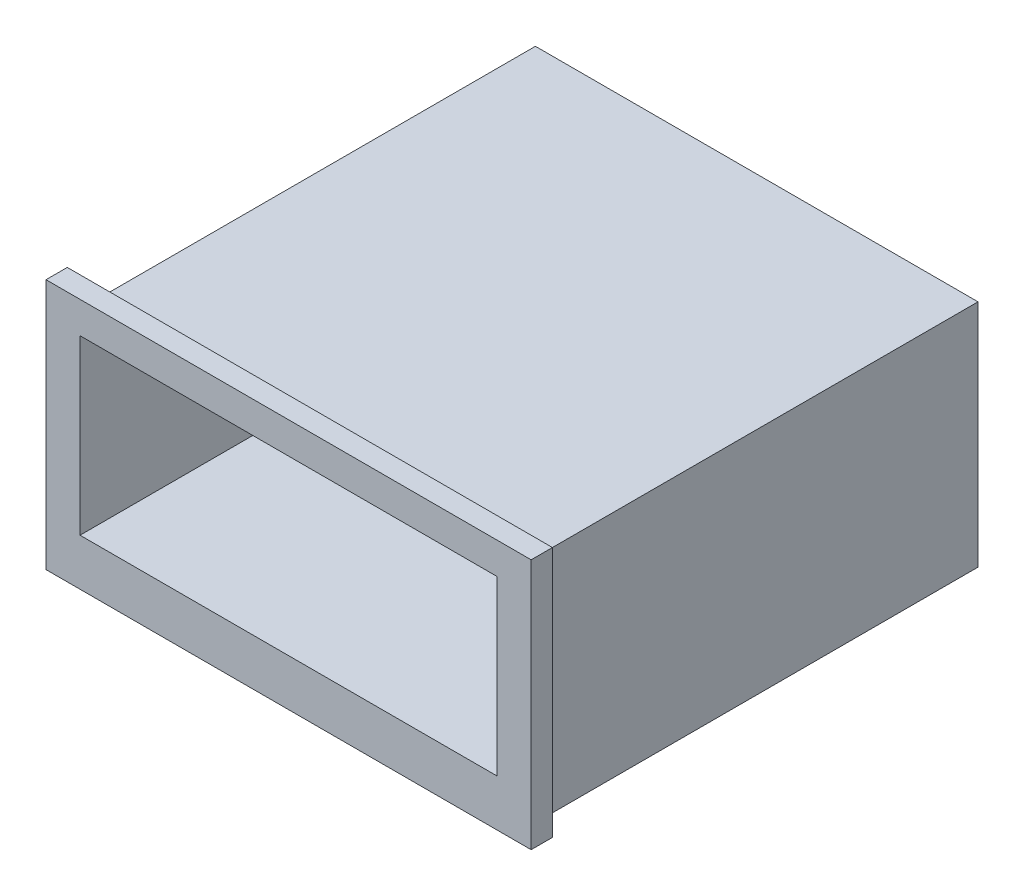
ISO-10303-21;
HEADER;
FILE_DESCRIPTION(('STEP AP214'),'2;1');
FILE_NAME('part.step','',(''),(''),'','','');
FILE_SCHEMA(('AUTOMOTIVE_DESIGN { 1 0 10303 214 1 1 1 1 }'));
ENDSEC;
DATA;
#1=APPLICATION_CONTEXT('core data for automotive mechanical design processes');
#2=APPLICATION_PROTOCOL_DEFINITION('international standard','automotive_design',2000,#1);
#3=PRODUCT_CONTEXT('',#1,'mechanical');
#4=PRODUCT('Part','Part','',(#3));
#5=PRODUCT_RELATED_PRODUCT_CATEGORY('part','',(#4));
#6=PRODUCT_DEFINITION_FORMATION('','',#4);
#7=PRODUCT_DEFINITION_CONTEXT('part definition',#1,'design');
#8=PRODUCT_DEFINITION('design','',#6,#7);
#9=PRODUCT_DEFINITION_SHAPE('','',#8);
#10=(LENGTH_UNIT() NAMED_UNIT(*) SI_UNIT(.MILLI.,.METRE.));
#11=(NAMED_UNIT(*) PLANE_ANGLE_UNIT() SI_UNIT($,.RADIAN.));
#12=(NAMED_UNIT(*) SI_UNIT($,.STERADIAN.) SOLID_ANGLE_UNIT());
#13=UNCERTAINTY_MEASURE_WITH_UNIT(LENGTH_MEASURE(1.E-05),#10,'distance_accuracy_value','');
#14=(GEOMETRIC_REPRESENTATION_CONTEXT(3) GLOBAL_UNCERTAINTY_ASSIGNED_CONTEXT((#13)) GLOBAL_UNIT_ASSIGNED_CONTEXT((#10,
#11,#12)) REPRESENTATION_CONTEXT('',''));
#15=CARTESIAN_POINT('',(0.,0.,0.));
#16=DIRECTION('',(0.,0.,1.));
#17=DIRECTION('',(1.,0.,0.));
#18=AXIS2_PLACEMENT_3D('',#15,#16,#17);
#19=CARTESIAN_POINT('',(-6.223,6.5532,0.635));
#20=DIRECTION('',(0.,0.,1.));
#21=DIRECTION('',(1.,0.,0.));
#22=AXIS2_PLACEMENT_3D('',#19,#20,#21);
#23=PLANE('',#22);
#24=DIRECTION('',(0.,1.,0.));
#25=VECTOR('',#24,1.);
#26=CARTESIAN_POINT('',(6.223,6.5532,0.635));
#27=LINE('',#26,#25);
#28=CARTESIAN_POINT('',(6.223,1.397,0.635));
#29=VERTEX_POINT('',#28);
#30=CARTESIAN_POINT('',(6.223,6.5532,0.635));
#31=VERTEX_POINT('',#30);
#32=EDGE_CURVE('E104',#29,#31,#27,.T.);
#33=ORIENTED_EDGE('',*,*,#32,.T.);
#34=DIRECTION('',(1.,0.,0.));
#35=VECTOR('',#34,1.);
#36=CARTESIAN_POINT('',(-6.223,6.5532,0.635));
#37=LINE('',#36,#35);
#38=CARTESIAN_POINT('',(-6.223,6.5532,0.635));
#39=VERTEX_POINT('',#38);
#40=EDGE_CURVE('E212',#31,#39,#37,.F.);
#41=ORIENTED_EDGE('',*,*,#40,.T.);
#42=DIRECTION('',(0.,1.,0.));
#43=VECTOR('',#42,1.);
#44=CARTESIAN_POINT('',(-6.223,6.5532,0.635));
#45=LINE('',#44,#43);
#46=CARTESIAN_POINT('',(-6.223,1.397,0.635));
#47=VERTEX_POINT('',#46);
#48=EDGE_CURVE('E109',#39,#47,#45,.F.);
#49=ORIENTED_EDGE('',*,*,#48,.T.);
#50=DIRECTION('',(1.,0.,0.));
#51=VECTOR('',#50,1.);
#52=CARTESIAN_POINT('',(-6.223,1.397,0.635));
#53=LINE('',#52,#51);
#54=EDGE_CURVE('E107',#47,#29,#53,.T.);
#55=ORIENTED_EDGE('',*,*,#54,.T.);
#56=EDGE_LOOP('',(#33,#41,#49,#55));
#57=FACE_BOUND('',#56,.T.);
#58=ADVANCED_FACE('F17',(#57),#23,.T.);
#59=CARTESIAN_POINT('',(-7.239,7.493,6.35));
#60=DIRECTION('',(-1.,0.,0.));
#61=DIRECTION('',(0.,0.,1.));
#62=AXIS2_PLACEMENT_3D('',#59,#60,#61);
#63=PLANE('',#62);
#64=DIRECTION('',(0.,1.,0.));
#65=VECTOR('',#64,1.);
#66=CARTESIAN_POINT('',(-7.239,0.,6.35));
#67=LINE('',#66,#65);
#68=CARTESIAN_POINT('',(-7.239,7.493,6.35));
#69=VERTEX_POINT('',#68);
#70=CARTESIAN_POINT('',(-7.239,0.,6.35));
#71=VERTEX_POINT('',#70);
#72=EDGE_CURVE('E144',#69,#71,#67,.F.);
#73=ORIENTED_EDGE('',*,*,#72,.T.);
#74=DIRECTION('',(0.,0.,1.));
#75=VECTOR('',#74,1.);
#76=CARTESIAN_POINT('',(-7.239,0.,6.35));
#77=LINE('',#76,#75);
#78=CARTESIAN_POINT('',(-7.239,0.,6.985));
#79=VERTEX_POINT('',#78);
#80=EDGE_CURVE('E20',#71,#79,#77,.T.);
#81=ORIENTED_EDGE('',*,*,#80,.T.);
#82=DIRECTION('',(0.,1.,0.));
#83=VECTOR('',#82,1.);
#84=CARTESIAN_POINT('',(-7.239,6.858,6.985));
#85=LINE('',#84,#83);
#86=CARTESIAN_POINT('',(-7.239,7.493,6.985));
#87=VERTEX_POINT('',#86);
#88=EDGE_CURVE('E142',#79,#87,#85,.T.);
#89=ORIENTED_EDGE('',*,*,#88,.T.);
#90=DIRECTION('',(0.,0.,1.));
#91=VECTOR('',#90,1.);
#92=CARTESIAN_POINT('',(-7.239,7.493,6.35));
#93=LINE('',#92,#91);
#94=EDGE_CURVE('E132',#69,#87,#93,.T.);
#95=ORIENTED_EDGE('',*,*,#94,.F.);
#96=EDGE_LOOP('',(#73,#81,#89,#95));
#97=FACE_BOUND('',#96,.T.);
#98=ADVANCED_FACE('F141',(#97),#63,.T.);
#99=CARTESIAN_POINT('',(-7.239,7.493,6.35));
#100=DIRECTION('',(0.,1.,0.));
#101=DIRECTION('',(0.,0.,1.));
#102=AXIS2_PLACEMENT_3D('',#99,#100,#101);
#103=PLANE('',#102);
#104=DIRECTION('',(1.,0.,0.));
#105=VECTOR('',#104,1.);
#106=CARTESIAN_POINT('',(-7.239,7.493,6.35));
#107=LINE('',#106,#105);
#108=CARTESIAN_POINT('',(7.239,7.493,6.35));
#109=VERTEX_POINT('',#108);
#110=EDGE_CURVE('E204',#109,#69,#107,.F.);
#111=ORIENTED_EDGE('',*,*,#110,.T.);
#112=ORIENTED_EDGE('',*,*,#94,.T.);
#113=DIRECTION('',(-1.,0.,0.));
#114=VECTOR('',#113,1.);
#115=CARTESIAN_POINT('',(-6.604,7.493,6.985));
#116=LINE('',#115,#114);
#117=CARTESIAN_POINT('',(7.239,7.493,6.985));
#118=VERTEX_POINT('',#117);
#119=EDGE_CURVE('E152',#87,#118,#116,.F.);
#120=ORIENTED_EDGE('',*,*,#119,.T.);
#121=DIRECTION('',(0.,0.,-1.));
#122=VECTOR('',#121,1.);
#123=CARTESIAN_POINT('',(7.239,7.493,6.35));
#124=LINE('',#123,#122);
#125=EDGE_CURVE('E115',#109,#118,#124,.F.);
#126=ORIENTED_EDGE('',*,*,#125,.F.);
#127=EDGE_LOOP('',(#111,#112,#120,#126));
#128=FACE_BOUND('',#127,.T.);
#129=ADVANCED_FACE('F307',(#128),#103,.T.);
#130=CARTESIAN_POINT('',(7.239,7.493,6.35));
#131=DIRECTION('',(1.,0.,0.));
#132=DIRECTION('',(0.,0.,-1.));
#133=AXIS2_PLACEMENT_3D('',#130,#131,#132);
#134=PLANE('',#133);
#135=DIRECTION('',(0.,1.,0.));
#136=VECTOR('',#135,1.);
#137=CARTESIAN_POINT('',(7.239,0.,6.35));
#138=LINE('',#137,#136);
#139=CARTESIAN_POINT('',(7.239,0.,6.35));
#140=VERTEX_POINT('',#139);
#141=EDGE_CURVE('E197',#140,#109,#138,.T.);
#142=ORIENTED_EDGE('',*,*,#141,.T.);
#143=ORIENTED_EDGE('',*,*,#125,.T.);
#144=DIRECTION('',(0.,1.,0.));
#145=VECTOR('',#144,1.);
#146=CARTESIAN_POINT('',(7.239,6.858,6.985));
#147=LINE('',#146,#145);
#148=CARTESIAN_POINT('',(7.239,0.,6.985));
#149=VERTEX_POINT('',#148);
#150=EDGE_CURVE('E182',#118,#149,#147,.F.);
#151=ORIENTED_EDGE('',*,*,#150,.T.);
#152=DIRECTION('',(0.,0.,-1.));
#153=VECTOR('',#152,1.);
#154=CARTESIAN_POINT('',(7.239,0.,6.35));
#155=LINE('',#154,#153);
#156=EDGE_CURVE('E131',#149,#140,#155,.T.);
#157=ORIENTED_EDGE('',*,*,#156,.T.);
#158=EDGE_LOOP('',(#142,#143,#151,#157));
#159=FACE_BOUND('',#158,.T.);
#160=ADVANCED_FACE('F300',(#159),#134,.T.);
#161=CARTESIAN_POINT('',(-6.223,1.397,0.635));
#162=DIRECTION('',(0.,-1.,0.));
#163=DIRECTION('',(0.,0.,-1.));
#164=AXIS2_PLACEMENT_3D('',#161,#162,#163);
#165=PLANE('',#164);
#166=ORIENTED_EDGE('',*,*,#54,.F.);
#167=DIRECTION('',(0.,0.,1.));
#168=VECTOR('',#167,1.);
#169=CARTESIAN_POINT('',(-6.223,1.397,0.635));
#170=LINE('',#169,#168);
#171=CARTESIAN_POINT('',(-6.223,1.397,6.985));
#172=VERTEX_POINT('',#171);
#173=EDGE_CURVE('E206',#47,#172,#170,.T.);
#174=ORIENTED_EDGE('',*,*,#173,.T.);
#175=DIRECTION('',(-1.,0.,0.));
#176=VECTOR('',#175,1.);
#177=CARTESIAN_POINT('',(-6.604,1.397,6.985));
#178=LINE('',#177,#176);
#179=CARTESIAN_POINT('',(6.223,1.397,6.985));
#180=VERTEX_POINT('',#179);
#181=EDGE_CURVE('E126',#172,#180,#178,.F.);
#182=ORIENTED_EDGE('',*,*,#181,.T.);
#183=DIRECTION('',(0.,0.,-1.));
#184=VECTOR('',#183,1.);
#185=CARTESIAN_POINT('',(6.223,1.397,0.635));
#186=LINE('',#185,#184);
#187=EDGE_CURVE('E114',#180,#29,#186,.T.);
#188=ORIENTED_EDGE('',*,*,#187,.T.);
#189=EDGE_LOOP('',(#166,#174,#182,#188));
#190=FACE_BOUND('',#189,.T.);
#191=ADVANCED_FACE('F125',(#190),#165,.F.);
#192=CARTESIAN_POINT('',(6.223,6.5532,0.635));
#193=DIRECTION('',(1.,0.,0.));
#194=DIRECTION('',(0.,0.,-1.));
#195=AXIS2_PLACEMENT_3D('',#192,#193,#194);
#196=PLANE('',#195);
#197=ORIENTED_EDGE('',*,*,#32,.F.);
#198=ORIENTED_EDGE('',*,*,#187,.F.);
#199=DIRECTION('',(0.,1.,0.));
#200=VECTOR('',#199,1.);
#201=CARTESIAN_POINT('',(6.223,6.858,6.985));
#202=LINE('',#201,#200);
#203=CARTESIAN_POINT('',(6.223,6.5532,6.985));
#204=VERTEX_POINT('',#203);
#205=EDGE_CURVE('E179',#180,#204,#202,.T.);
#206=ORIENTED_EDGE('',*,*,#205,.T.);
#207=DIRECTION('',(0.,0.,1.));
#208=VECTOR('',#207,1.);
#209=CARTESIAN_POINT('',(6.223,6.5532,0.635));
#210=LINE('',#209,#208);
#211=EDGE_CURVE('E122',#204,#31,#210,.F.);
#212=ORIENTED_EDGE('',*,*,#211,.T.);
#213=EDGE_LOOP('',(#197,#198,#206,#212));
#214=FACE_BOUND('',#213,.T.);
#215=ADVANCED_FACE('F119',(#214),#196,.F.);
#216=CARTESIAN_POINT('',(-6.223,6.5532,0.635));
#217=DIRECTION('',(0.,1.,0.));
#218=DIRECTION('',(0.,0.,1.));
#219=AXIS2_PLACEMENT_3D('',#216,#217,#218);
#220=PLANE('',#219);
#221=ORIENTED_EDGE('',*,*,#40,.F.);
#222=ORIENTED_EDGE('',*,*,#211,.F.);
#223=DIRECTION('',(-1.,0.,0.));
#224=VECTOR('',#223,1.);
#225=CARTESIAN_POINT('',(-6.604,6.5532,6.985));
#226=LINE('',#225,#224);
#227=CARTESIAN_POINT('',(-6.223,6.5532,6.985));
#228=VERTEX_POINT('',#227);
#229=EDGE_CURVE('E176',#204,#228,#226,.T.);
#230=ORIENTED_EDGE('',*,*,#229,.T.);
#231=DIRECTION('',(0.,0.,1.));
#232=VECTOR('',#231,1.);
#233=CARTESIAN_POINT('',(-6.223,6.5532,0.635));
#234=LINE('',#233,#232);
#235=EDGE_CURVE('E209',#228,#39,#234,.F.);
#236=ORIENTED_EDGE('',*,*,#235,.T.);
#237=EDGE_LOOP('',(#221,#222,#230,#236));
#238=FACE_BOUND('',#237,.T.);
#239=ADVANCED_FACE('F217',(#238),#220,.F.);
#240=CARTESIAN_POINT('',(-6.223,6.5532,0.635));
#241=DIRECTION('',(-1.,0.,0.));
#242=DIRECTION('',(0.,0.,1.));
#243=AXIS2_PLACEMENT_3D('',#240,#241,#242);
#244=PLANE('',#243);
#245=ORIENTED_EDGE('',*,*,#48,.F.);
#246=ORIENTED_EDGE('',*,*,#235,.F.);
#247=DIRECTION('',(0.,1.,0.));
#248=VECTOR('',#247,1.);
#249=CARTESIAN_POINT('',(-6.223,6.858,6.985));
#250=LINE('',#249,#248);
#251=EDGE_CURVE('E173',#228,#172,#250,.F.);
#252=ORIENTED_EDGE('',*,*,#251,.T.);
#253=ORIENTED_EDGE('',*,*,#173,.F.);
#254=EDGE_LOOP('',(#245,#246,#252,#253));
#255=FACE_BOUND('',#254,.T.);
#256=ADVANCED_FACE('F215',(#255),#244,.F.);
#257=CARTESIAN_POINT('',(-7.239,0.,6.35));
#258=DIRECTION('',(0.,0.,1.));
#259=DIRECTION('',(1.,0.,0.));
#260=AXIS2_PLACEMENT_3D('',#257,#258,#259);
#261=PLANE('',#260);
#262=DIRECTION('',(1.,0.,0.));
#263=VECTOR('',#262,1.);
#264=CARTESIAN_POINT('',(-7.239,0.,6.35));
#265=LINE('',#264,#263);
#266=CARTESIAN_POINT('',(6.604,0.,6.35));
#267=VERTEX_POINT('',#266);
#268=EDGE_CURVE('E35',#267,#140,#265,.T.);
#269=ORIENTED_EDGE('',*,*,#268,.F.);
#270=DIRECTION('',(0.,1.,0.));
#271=VECTOR('',#270,1.);
#272=CARTESIAN_POINT('',(6.604,6.858,6.35));
#273=LINE('',#272,#271);
#274=CARTESIAN_POINT('',(6.604,6.858,6.35));
#275=VERTEX_POINT('',#274);
#276=EDGE_CURVE('E171',#267,#275,#273,.T.);
#277=ORIENTED_EDGE('',*,*,#276,.T.);
#278=DIRECTION('',(1.,0.,0.));
#279=VECTOR('',#278,1.);
#280=CARTESIAN_POINT('',(-6.604,6.858,6.35));
#281=LINE('',#280,#279);
#282=CARTESIAN_POINT('',(-6.604,6.858,6.35));
#283=VERTEX_POINT('',#282);
#284=EDGE_CURVE('E195',#283,#275,#281,.T.);
#285=ORIENTED_EDGE('',*,*,#284,.F.);
#286=DIRECTION('',(0.,1.,0.));
#287=VECTOR('',#286,1.);
#288=CARTESIAN_POINT('',(-6.604,6.858,6.35));
#289=LINE('',#288,#287);
#290=CARTESIAN_POINT('',(-6.604,0.,6.35));
#291=VERTEX_POINT('',#290);
#292=EDGE_CURVE('E190',#283,#291,#289,.F.);
#293=ORIENTED_EDGE('',*,*,#292,.T.);
#294=DIRECTION('',(1.,0.,0.));
#295=VECTOR('',#294,1.);
#296=CARTESIAN_POINT('',(-7.239,0.,6.35));
#297=LINE('',#296,#295);
#298=EDGE_CURVE('E201',#71,#291,#297,.T.);
#299=ORIENTED_EDGE('',*,*,#298,.F.);
#300=ORIENTED_EDGE('',*,*,#72,.F.);
#301=ORIENTED_EDGE('',*,*,#110,.F.);
#302=ORIENTED_EDGE('',*,*,#141,.F.);
#303=EDGE_LOOP('',(#269,#277,#285,#293,#299,#300,#301,#302));
#304=FACE_BOUND('',#303,.T.);
#305=ADVANCED_FACE('F268',(#304),#261,.F.);
#306=CARTESIAN_POINT('',(-6.604,6.858,6.985));
#307=DIRECTION('',(0.,1.,0.));
#308=DIRECTION('',(0.,0.,1.));
#309=AXIS2_PLACEMENT_3D('',#306,#307,#308);
#310=PLANE('',#309);
#311=DIRECTION('',(0.,0.,1.));
#312=VECTOR('',#311,1.);
#313=CARTESIAN_POINT('',(6.604,6.858,-6.985));
#314=LINE('',#313,#312);
#315=CARTESIAN_POINT('',(6.604,6.858,-6.985));
#316=VERTEX_POINT('',#315);
#317=EDGE_CURVE('E168',#275,#316,#314,.F.);
#318=ORIENTED_EDGE('',*,*,#317,.T.);
#319=DIRECTION('',(1.,0.,0.));
#320=VECTOR('',#319,1.);
#321=CARTESIAN_POINT('',(-6.604,6.858,-6.985));
#322=LINE('',#321,#320);
#323=CARTESIAN_POINT('',(-6.604,6.858,-6.985));
#324=VERTEX_POINT('',#323);
#325=EDGE_CURVE('E193',#316,#324,#322,.F.);
#326=ORIENTED_EDGE('',*,*,#325,.T.);
#327=DIRECTION('',(0.,0.,-1.));
#328=VECTOR('',#327,1.);
#329=CARTESIAN_POINT('',(-6.604,6.858,-6.985));
#330=LINE('',#329,#328);
#331=EDGE_CURVE('E153',#324,#283,#330,.F.);
#332=ORIENTED_EDGE('',*,*,#331,.T.);
#333=ORIENTED_EDGE('',*,*,#284,.T.);
#334=EDGE_LOOP('',(#318,#326,#332,#333));
#335=FACE_BOUND('',#334,.T.);
#336=ADVANCED_FACE('F260',(#335),#310,.T.);
#337=CARTESIAN_POINT('',(-6.604,6.858,-6.985));
#338=DIRECTION('',(0.,0.,1.));
#339=DIRECTION('',(1.,0.,0.));
#340=AXIS2_PLACEMENT_3D('',#337,#338,#339);
#341=PLANE('',#340);
#342=ORIENTED_EDGE('',*,*,#325,.F.);
#343=DIRECTION('',(0.,1.,0.));
#344=VECTOR('',#343,1.);
#345=CARTESIAN_POINT('',(6.604,6.858,-6.985));
#346=LINE('',#345,#344);
#347=CARTESIAN_POINT('',(6.604,0.,-6.985));
#348=VERTEX_POINT('',#347);
#349=EDGE_CURVE('E165',#316,#348,#346,.F.);
#350=ORIENTED_EDGE('',*,*,#349,.T.);
#351=DIRECTION('',(1.,0.,0.));
#352=VECTOR('',#351,1.);
#353=CARTESIAN_POINT('',(-6.604,0.,-6.985));
#354=LINE('',#353,#352);
#355=CARTESIAN_POINT('',(-6.604,0.,-6.985));
#356=VERTEX_POINT('',#355);
#357=EDGE_CURVE('E160',#348,#356,#354,.F.);
#358=ORIENTED_EDGE('',*,*,#357,.T.);
#359=DIRECTION('',(0.,1.,0.));
#360=VECTOR('',#359,1.);
#361=CARTESIAN_POINT('',(-6.604,6.858,-6.985));
#362=LINE('',#361,#360);
#363=EDGE_CURVE('E187',#356,#324,#362,.T.);
#364=ORIENTED_EDGE('',*,*,#363,.T.);
#365=EDGE_LOOP('',(#342,#350,#358,#364));
#366=FACE_BOUND('',#365,.T.);
#367=ADVANCED_FACE('F231',(#366),#341,.F.);
#368=CARTESIAN_POINT('',(-6.604,6.858,-6.985));
#369=DIRECTION('',(1.,0.,0.));
#370=DIRECTION('',(0.,0.,-1.));
#371=AXIS2_PLACEMENT_3D('',#368,#369,#370);
#372=PLANE('',#371);
#373=ORIENTED_EDGE('',*,*,#363,.F.);
#374=DIRECTION('',(0.,0.,1.));
#375=VECTOR('',#374,1.);
#376=CARTESIAN_POINT('',(-6.604,0.,6.985));
#377=LINE('',#376,#375);
#378=EDGE_CURVE('E157',#356,#291,#377,.T.);
#379=ORIENTED_EDGE('',*,*,#378,.T.);
#380=ORIENTED_EDGE('',*,*,#292,.F.);
#381=ORIENTED_EDGE('',*,*,#331,.F.);
#382=EDGE_LOOP('',(#373,#379,#380,#381));
#383=FACE_BOUND('',#382,.T.);
#384=ADVANCED_FACE('F222',(#383),#372,.F.);
#385=CARTESIAN_POINT('',(-6.604,6.858,6.985));
#386=DIRECTION('',(0.,0.,-1.));
#387=DIRECTION('',(-1.,0.,0.));
#388=AXIS2_PLACEMENT_3D('',#385,#386,#387);
#389=PLANE('',#388);
#390=ORIENTED_EDGE('',*,*,#229,.F.);
#391=ORIENTED_EDGE('',*,*,#205,.F.);
#392=ORIENTED_EDGE('',*,*,#181,.F.);
#393=ORIENTED_EDGE('',*,*,#251,.F.);
#394=EDGE_LOOP('',(#390,#391,#392,#393));
#395=FACE_BOUND('',#394,.T.);
#396=ORIENTED_EDGE('',*,*,#150,.F.);
#397=ORIENTED_EDGE('',*,*,#119,.F.);
#398=ORIENTED_EDGE('',*,*,#88,.F.);
#399=DIRECTION('',(1.,0.,0.));
#400=VECTOR('',#399,1.);
#401=CARTESIAN_POINT('',(-6.604,0.,6.985));
#402=LINE('',#401,#400);
#403=EDGE_CURVE('E26',#79,#149,#402,.T.);
#404=ORIENTED_EDGE('',*,*,#403,.T.);
#405=EDGE_LOOP('',(#396,#397,#398,#404));
#406=FACE_BOUND('',#405,.T.);
#407=ADVANCED_FACE('F151',(#395,#406),#389,.F.);
#408=CARTESIAN_POINT('',(6.604,6.858,-6.985));
#409=DIRECTION('',(-1.,0.,0.));
#410=DIRECTION('',(0.,0.,1.));
#411=AXIS2_PLACEMENT_3D('',#408,#409,#410);
#412=PLANE('',#411);
#413=ORIENTED_EDGE('',*,*,#349,.F.);
#414=ORIENTED_EDGE('',*,*,#317,.F.);
#415=ORIENTED_EDGE('',*,*,#276,.F.);
#416=DIRECTION('',(0.,0.,1.));
#417=VECTOR('',#416,1.);
#418=CARTESIAN_POINT('',(6.604,0.,6.985));
#419=LINE('',#418,#417);
#420=EDGE_CURVE('E11',#267,#348,#419,.F.);
#421=ORIENTED_EDGE('',*,*,#420,.T.);
#422=EDGE_LOOP('',(#413,#414,#415,#421));
#423=FACE_BOUND('',#422,.T.);
#424=ADVANCED_FACE('F221',(#423),#412,.F.);
#425=CARTESIAN_POINT('',(-6.604,0.,6.985));
#426=DIRECTION('',(0.,1.,0.));
#427=DIRECTION('',(0.,0.,1.));
#428=AXIS2_PLACEMENT_3D('',#425,#426,#427);
#429=PLANE('',#428);
#430=ORIENTED_EDGE('',*,*,#268,.T.);
#431=ORIENTED_EDGE('',*,*,#156,.F.);
#432=ORIENTED_EDGE('',*,*,#403,.F.);
#433=ORIENTED_EDGE('',*,*,#80,.F.);
#434=ORIENTED_EDGE('',*,*,#298,.T.);
#435=ORIENTED_EDGE('',*,*,#378,.F.);
#436=ORIENTED_EDGE('',*,*,#357,.F.);
#437=ORIENTED_EDGE('',*,*,#420,.F.);
#438=EDGE_LOOP('',(#430,#431,#432,#433,#434,#435,#436,#437));
#439=FACE_BOUND('',#438,.T.);
#440=ADVANCED_FACE('F155',(#439),#429,.F.);
#441=CLOSED_SHELL('',(#58,#98,#129,#160,#191,#215,#239,#256,#305,#336,#367,#384,#407,#424,#440));
#442=MANIFOLD_SOLID_BREP('B1',#441);
#443=ADVANCED_BREP_SHAPE_REPRESENTATION('',(#18,#442),#14);
#444=SHAPE_DEFINITION_REPRESENTATION(#9,#443);
ENDSEC;
END-ISO-10303-21;
